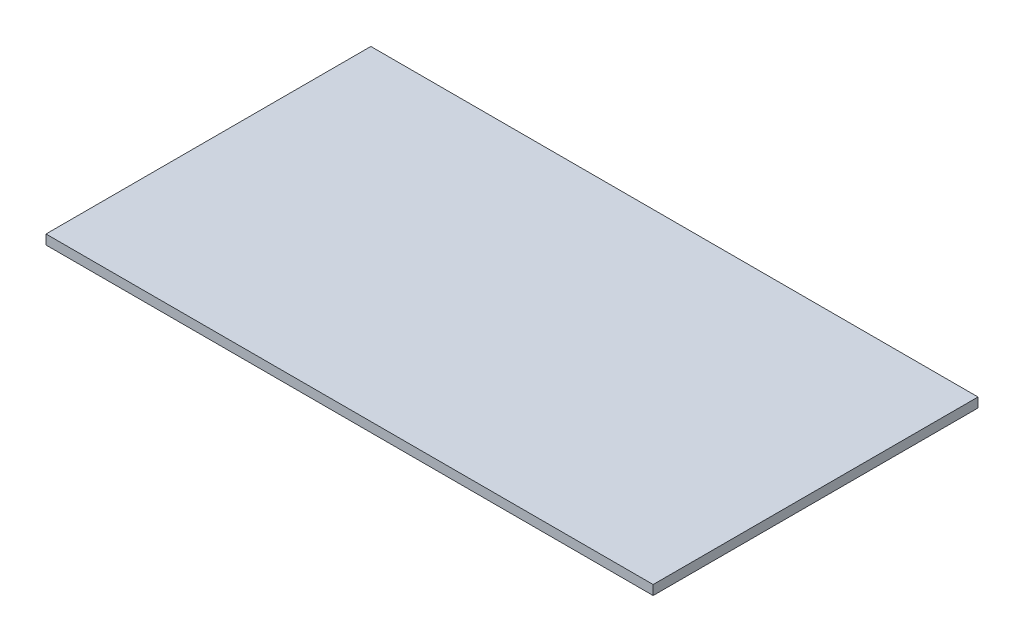
ISO-10303-21;
HEADER;
FILE_DESCRIPTION(('STEP AP214'),'2;1');
FILE_NAME('part.step','',(''),(''),'','','');
FILE_SCHEMA(('AUTOMOTIVE_DESIGN { 1 0 10303 214 1 1 1 1 }'));
ENDSEC;
DATA;
#1=APPLICATION_CONTEXT('core data for automotive mechanical design processes');
#2=APPLICATION_PROTOCOL_DEFINITION('international standard','automotive_design',2000,#1);
#3=PRODUCT_CONTEXT('',#1,'mechanical');
#4=PRODUCT('Part','Part','',(#3));
#5=PRODUCT_RELATED_PRODUCT_CATEGORY('part','',(#4));
#6=PRODUCT_DEFINITION_FORMATION('','',#4);
#7=PRODUCT_DEFINITION_CONTEXT('part definition',#1,'design');
#8=PRODUCT_DEFINITION('design','',#6,#7);
#9=PRODUCT_DEFINITION_SHAPE('','',#8);
#10=(LENGTH_UNIT() NAMED_UNIT(*) SI_UNIT(.MILLI.,.METRE.));
#11=(NAMED_UNIT(*) PLANE_ANGLE_UNIT() SI_UNIT($,.RADIAN.));
#12=(NAMED_UNIT(*) SI_UNIT($,.STERADIAN.) SOLID_ANGLE_UNIT());
#13=UNCERTAINTY_MEASURE_WITH_UNIT(LENGTH_MEASURE(1.E-05),#10,'distance_accuracy_value','');
#14=(GEOMETRIC_REPRESENTATION_CONTEXT(3) GLOBAL_UNCERTAINTY_ASSIGNED_CONTEXT((#13)) GLOBAL_UNIT_ASSIGNED_CONTEXT((#10,
#11,#12)) REPRESENTATION_CONTEXT('',''));
#15=CARTESIAN_POINT('',(0.,0.,0.));
#16=DIRECTION('',(0.,0.,1.));
#17=DIRECTION('',(1.,0.,0.));
#18=AXIS2_PLACEMENT_3D('',#15,#16,#17);
#19=CARTESIAN_POINT('',(-7.952,0.25,-4.24));
#20=DIRECTION('',(1.,0.,0.));
#21=DIRECTION('',(0.,0.,-1.));
#22=AXIS2_PLACEMENT_3D('',#19,#20,#21);
#23=PLANE('',#22);
#24=DIRECTION('',(0.,0.,1.));
#25=VECTOR('',#24,1.);
#26=CARTESIAN_POINT('',(-7.952,0.,-4.24));
#27=LINE('',#26,#25);
#28=CARTESIAN_POINT('',(-7.952,0.,-4.24));
#29=VERTEX_POINT('',#28);
#30=CARTESIAN_POINT('',(-7.952,0.,4.24));
#31=VERTEX_POINT('',#30);
#32=EDGE_CURVE('E98',#29,#31,#27,.T.);
#33=ORIENTED_EDGE('',*,*,#32,.T.);
#34=DIRECTION('',(0.,-1.,0.));
#35=VECTOR('',#34,1.);
#36=CARTESIAN_POINT('',(-7.952,0.25,4.24));
#37=LINE('',#36,#35);
#38=CARTESIAN_POINT('',(-7.952,0.25,4.24));
#39=VERTEX_POINT('',#38);
#40=EDGE_CURVE('E11',#39,#31,#37,.T.);
#41=ORIENTED_EDGE('',*,*,#40,.F.);
#42=DIRECTION('',(0.,0.,1.));
#43=VECTOR('',#42,1.);
#44=CARTESIAN_POINT('',(-7.952,0.25,-4.24));
#45=LINE('',#44,#43);
#46=CARTESIAN_POINT('',(-7.952,0.25,-4.24));
#47=VERTEX_POINT('',#46);
#48=EDGE_CURVE('E84',#47,#39,#45,.T.);
#49=ORIENTED_EDGE('',*,*,#48,.F.);
#50=DIRECTION('',(0.,-1.,0.));
#51=VECTOR('',#50,1.);
#52=CARTESIAN_POINT('',(-7.952,0.25,-4.24));
#53=LINE('',#52,#51);
#54=EDGE_CURVE('E94',#47,#29,#53,.T.);
#55=ORIENTED_EDGE('',*,*,#54,.T.);
#56=EDGE_LOOP('',(#33,#41,#49,#55));
#57=FACE_BOUND('',#56,.T.);
#58=ADVANCED_FACE('F34',(#57),#23,.F.);
#59=CARTESIAN_POINT('',(-7.952,0.25,4.24));
#60=DIRECTION('',(0.,0.,-1.));
#61=DIRECTION('',(-1.,0.,0.));
#62=AXIS2_PLACEMENT_3D('',#59,#60,#61);
#63=PLANE('',#62);
#64=DIRECTION('',(1.,0.,0.));
#65=VECTOR('',#64,1.);
#66=CARTESIAN_POINT('',(-7.952,0.,4.24));
#67=LINE('',#66,#65);
#68=CARTESIAN_POINT('',(7.898,0.,4.24));
#69=VERTEX_POINT('',#68);
#70=EDGE_CURVE('E89',#31,#69,#67,.T.);
#71=ORIENTED_EDGE('',*,*,#70,.T.);
#72=DIRECTION('',(0.,-1.,0.));
#73=VECTOR('',#72,1.);
#74=CARTESIAN_POINT('',(7.898,0.25,4.24));
#75=LINE('',#74,#73);
#76=CARTESIAN_POINT('',(7.898,0.25,4.24));
#77=VERTEX_POINT('',#76);
#78=EDGE_CURVE('E42',#77,#69,#75,.T.);
#79=ORIENTED_EDGE('',*,*,#78,.F.);
#80=DIRECTION('',(1.,0.,0.));
#81=VECTOR('',#80,1.);
#82=CARTESIAN_POINT('',(-7.952,0.25,4.24));
#83=LINE('',#82,#81);
#84=EDGE_CURVE('E78',#39,#77,#83,.T.);
#85=ORIENTED_EDGE('',*,*,#84,.F.);
#86=ORIENTED_EDGE('',*,*,#40,.T.);
#87=EDGE_LOOP('',(#71,#79,#85,#86));
#88=FACE_BOUND('',#87,.T.);
#89=ADVANCED_FACE('F88',(#88),#63,.F.);
#90=CARTESIAN_POINT('',(7.898,0.25,4.24));
#91=DIRECTION('',(-1.,0.,0.));
#92=DIRECTION('',(0.,0.,1.));
#93=AXIS2_PLACEMENT_3D('',#90,#91,#92);
#94=PLANE('',#93);
#95=DIRECTION('',(0.,0.,-1.));
#96=VECTOR('',#95,1.);
#97=CARTESIAN_POINT('',(7.898,0.,4.24));
#98=LINE('',#97,#96);
#99=CARTESIAN_POINT('',(7.898,0.,-4.24));
#100=VERTEX_POINT('',#99);
#101=EDGE_CURVE('E102',#69,#100,#98,.T.);
#102=ORIENTED_EDGE('',*,*,#101,.T.);
#103=DIRECTION('',(0.,-1.,0.));
#104=VECTOR('',#103,1.);
#105=CARTESIAN_POINT('',(7.898,0.25,-4.24));
#106=LINE('',#105,#104);
#107=CARTESIAN_POINT('',(7.898,0.25,-4.24));
#108=VERTEX_POINT('',#107);
#109=EDGE_CURVE('E91',#108,#100,#106,.T.);
#110=ORIENTED_EDGE('',*,*,#109,.F.);
#111=DIRECTION('',(0.,0.,-1.));
#112=VECTOR('',#111,1.);
#113=CARTESIAN_POINT('',(7.898,0.25,4.24));
#114=LINE('',#113,#112);
#115=EDGE_CURVE('E81',#77,#108,#114,.T.);
#116=ORIENTED_EDGE('',*,*,#115,.F.);
#117=ORIENTED_EDGE('',*,*,#78,.T.);
#118=EDGE_LOOP('',(#102,#110,#116,#117));
#119=FACE_BOUND('',#118,.T.);
#120=ADVANCED_FACE('F92',(#119),#94,.F.);
#121=CARTESIAN_POINT('',(0.,0.25,-4.24));
#122=DIRECTION('',(0.,0.,1.));
#123=DIRECTION('',(1.,0.,0.));
#124=AXIS2_PLACEMENT_3D('',#121,#122,#123);
#125=PLANE('',#124);
#126=DIRECTION('',(-1.,0.,0.));
#127=VECTOR('',#126,1.);
#128=CARTESIAN_POINT('',(0.,0.,-4.24));
#129=LINE('',#128,#127);
#130=EDGE_CURVE('E67',#100,#29,#129,.T.);
#131=ORIENTED_EDGE('',*,*,#130,.T.);
#132=ORIENTED_EDGE('',*,*,#54,.F.);
#133=DIRECTION('',(-1.,0.,0.));
#134=VECTOR('',#133,1.);
#135=CARTESIAN_POINT('',(7.898,0.25,-4.24));
#136=LINE('',#135,#134);
#137=EDGE_CURVE('E50',#108,#47,#136,.T.);
#138=ORIENTED_EDGE('',*,*,#137,.F.);
#139=ORIENTED_EDGE('',*,*,#109,.T.);
#140=EDGE_LOOP('',(#131,#132,#138,#139));
#141=FACE_BOUND('',#140,.T.);
#142=ADVANCED_FACE('F106',(#141),#125,.F.);
#143=CARTESIAN_POINT('',(0.,0.25,0.));
#144=DIRECTION('',(0.,1.,0.));
#145=DIRECTION('',(0.,0.,1.));
#146=AXIS2_PLACEMENT_3D('',#143,#144,#145);
#147=PLANE('',#146);
#148=ORIENTED_EDGE('',*,*,#48,.T.);
#149=ORIENTED_EDGE('',*,*,#84,.T.);
#150=ORIENTED_EDGE('',*,*,#115,.T.);
#151=ORIENTED_EDGE('',*,*,#137,.T.);
#152=EDGE_LOOP('',(#148,#149,#150,#151));
#153=FACE_BOUND('',#152,.T.);
#154=ADVANCED_FACE('F79',(#153),#147,.T.);
#155=CARTESIAN_POINT('',(0.,0.,0.));
#156=DIRECTION('',(0.,1.,0.));
#157=DIRECTION('',(0.,0.,1.));
#158=AXIS2_PLACEMENT_3D('',#155,#156,#157);
#159=PLANE('',#158);
#160=ORIENTED_EDGE('',*,*,#32,.F.);
#161=ORIENTED_EDGE('',*,*,#130,.F.);
#162=ORIENTED_EDGE('',*,*,#101,.F.);
#163=ORIENTED_EDGE('',*,*,#70,.F.);
#164=EDGE_LOOP('',(#160,#161,#162,#163));
#165=FACE_BOUND('',#164,.T.);
#166=ADVANCED_FACE('F108',(#165),#159,.F.);
#167=CLOSED_SHELL('',(#58,#89,#120,#142,#154,#166));
#168=MANIFOLD_SOLID_BREP('B2',#167);
#169=ADVANCED_BREP_SHAPE_REPRESENTATION('',(#18,#168),#14);
#170=SHAPE_DEFINITION_REPRESENTATION(#9,#169);
ENDSEC;
END-ISO-10303-21;
